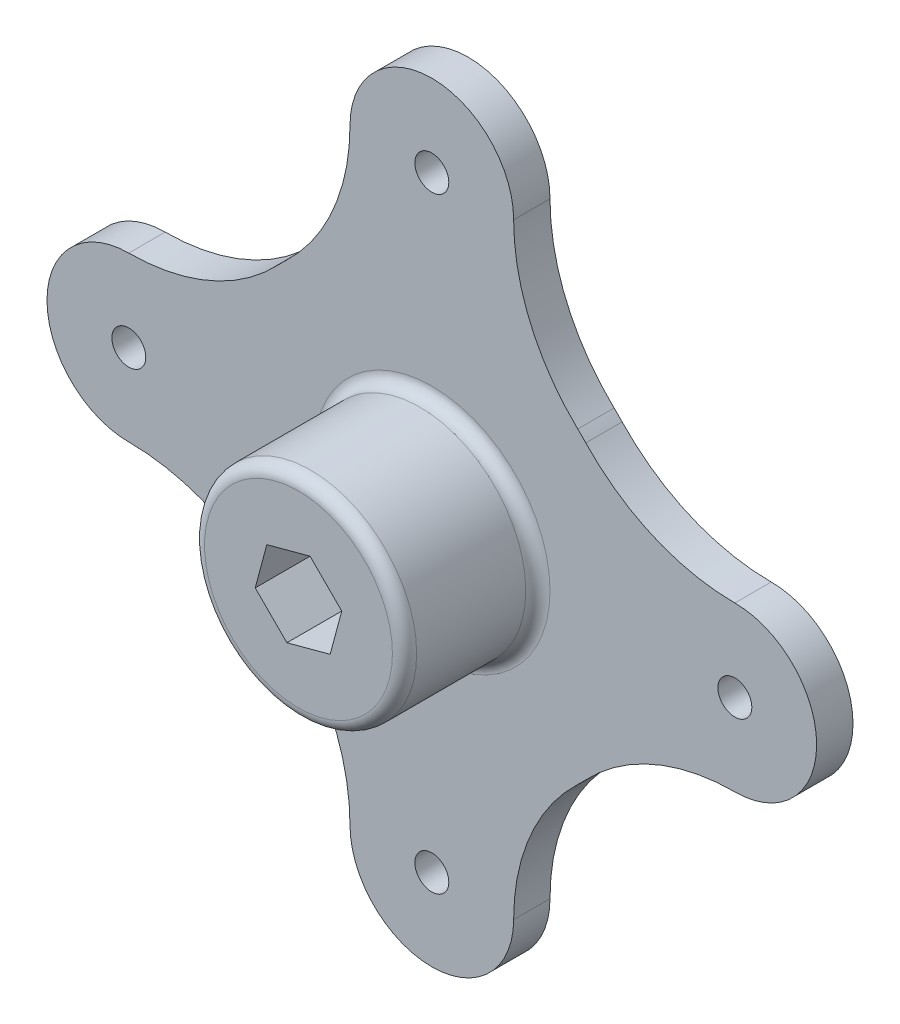
ISO-10303-21;
HEADER;
FILE_DESCRIPTION(('STEP AP214'),'2;1');
FILE_NAME('part.step','',(''),(''),'','','');
FILE_SCHEMA(('AUTOMOTIVE_DESIGN { 1 0 10303 214 1 1 1 1 }'));
ENDSEC;
DATA;
#1=APPLICATION_CONTEXT('core data for automotive mechanical design processes');
#2=APPLICATION_PROTOCOL_DEFINITION('international standard','automotive_design',2000,#1);
#3=PRODUCT_CONTEXT('',#1,'mechanical');
#4=PRODUCT('Part','Part','',(#3));
#5=PRODUCT_RELATED_PRODUCT_CATEGORY('part','',(#4));
#6=PRODUCT_DEFINITION_FORMATION('','',#4);
#7=PRODUCT_DEFINITION_CONTEXT('part definition',#1,'design');
#8=PRODUCT_DEFINITION('design','',#6,#7);
#9=PRODUCT_DEFINITION_SHAPE('','',#8);
#10=(LENGTH_UNIT() NAMED_UNIT(*) SI_UNIT(.MILLI.,.METRE.));
#11=(NAMED_UNIT(*) PLANE_ANGLE_UNIT() SI_UNIT($,.RADIAN.));
#12=(NAMED_UNIT(*) SI_UNIT($,.STERADIAN.) SOLID_ANGLE_UNIT());
#13=UNCERTAINTY_MEASURE_WITH_UNIT(LENGTH_MEASURE(1.E-05),#10,'distance_accuracy_value','');
#14=(GEOMETRIC_REPRESENTATION_CONTEXT(3) GLOBAL_UNCERTAINTY_ASSIGNED_CONTEXT((#13)) GLOBAL_UNIT_ASSIGNED_CONTEXT((#10,
#11,#12)) REPRESENTATION_CONTEXT('',''));
#15=CARTESIAN_POINT('',(0.,0.,0.));
#16=DIRECTION('',(0.,0.,1.));
#17=DIRECTION('',(1.,0.,0.));
#18=AXIS2_PLACEMENT_3D('',#15,#16,#17);
#19=CARTESIAN_POINT('',(0.,0.,14.));
#20=DIRECTION('',(0.,0.,1.));
#21=DIRECTION('',(1.,0.,0.));
#22=AXIS2_PLACEMENT_3D('',#19,#20,#21);
#23=PLANE('',#22);
#24=CARTESIAN_POINT('',(0.,0.,14.));
#25=DIRECTION('',(0.,0.,1.));
#26=DIRECTION('',(1.,0.,0.));
#27=AXIS2_PLACEMENT_3D('',#24,#25,#26);
#28=CIRCLE('',#27,7.75);
#29=CARTESIAN_POINT('',(7.75,0.,14.));
#30=VERTEX_POINT('',#29);
#31=EDGE_CURVE('E378',#30,#30,#28,.T.);
#32=ORIENTED_EDGE('',*,*,#31,.T.);
#33=EDGE_LOOP('',(#32));
#34=FACE_BOUND('',#33,.T.);
#35=DIRECTION('',(0.258819045102519,0.965925826289069,0.));
#36=VECTOR('',#35,1.);
#37=CARTESIAN_POINT('',(2.61278905896873,-2.61278905896872,14.));
#38=LINE('',#37,#36);
#39=CARTESIAN_POINT('',(2.61278905896873,-2.61278905896872,14.));
#40=VERTEX_POINT('',#39);
#41=CARTESIAN_POINT('',(3.56913622928131,0.956347170312597,14.));
#42=VERTEX_POINT('',#41);
#43=EDGE_CURVE('E207',#40,#42,#38,.T.);
#44=ORIENTED_EDGE('',*,*,#43,.F.);
#45=DIRECTION('',(0.965925826289068,0.258819045102523,0.));
#46=VECTOR('',#45,1.);
#47=CARTESIAN_POINT('',(-0.956347170312582,-3.56913622928132,14.));
#48=LINE('',#47,#46);
#49=CARTESIAN_POINT('',(-0.956347170312582,-3.56913622928132,14.));
#50=VERTEX_POINT('',#49);
#51=EDGE_CURVE('E190',#50,#40,#48,.T.);
#52=ORIENTED_EDGE('',*,*,#51,.F.);
#53=DIRECTION('',(0.707106781186549,-0.707106781186546,0.));
#54=VECTOR('',#53,1.);
#55=CARTESIAN_POINT('',(-3.56913622928131,-0.956347170312597,14.));
#56=LINE('',#55,#54);
#57=CARTESIAN_POINT('',(-3.56913622928131,-0.956347170312597,14.));
#58=VERTEX_POINT('',#57);
#59=EDGE_CURVE('E199',#58,#50,#56,.T.);
#60=ORIENTED_EDGE('',*,*,#59,.F.);
#61=DIRECTION('',(-0.258819045102519,-0.965925826289069,0.));
#62=VECTOR('',#61,1.);
#63=CARTESIAN_POINT('',(-2.61278905896873,2.61278905896872,14.));
#64=LINE('',#63,#62);
#65=CARTESIAN_POINT('',(-2.61278905896873,2.61278905896872,14.));
#66=VERTEX_POINT('',#65);
#67=EDGE_CURVE('E54',#66,#58,#64,.T.);
#68=ORIENTED_EDGE('',*,*,#67,.F.);
#69=DIRECTION('',(-0.965925826289068,-0.258819045102522,0.));
#70=VECTOR('',#69,1.);
#71=CARTESIAN_POINT('',(0.956347170312585,3.56913622928132,14.));
#72=LINE('',#71,#70);
#73=CARTESIAN_POINT('',(0.956347170312585,3.56913622928132,14.));
#74=VERTEX_POINT('',#73);
#75=EDGE_CURVE('E815',#74,#66,#72,.T.);
#76=ORIENTED_EDGE('',*,*,#75,.F.);
#77=DIRECTION('',(-0.707106781186549,0.707106781186546,0.));
#78=VECTOR('',#77,1.);
#79=CARTESIAN_POINT('',(3.56913622928131,0.956347170312597,14.));
#80=LINE('',#79,#78);
#81=EDGE_CURVE('E211',#42,#74,#80,.T.);
#82=ORIENTED_EDGE('',*,*,#81,.F.);
#83=EDGE_LOOP('',(#44,#52,#60,#68,#76,#82));
#84=FACE_BOUND('',#83,.T.);
#85=ADVANCED_FACE('F39',(#34,#84),#23,.T.);
#86=CARTESIAN_POINT('',(0.,0.,0.));
#87=DIRECTION('',(0.,0.,1.));
#88=DIRECTION('',(1.,0.,0.));
#89=AXIS2_PLACEMENT_3D('',#86,#87,#88);
#90=PLANE('',#89);
#91=CARTESIAN_POINT('',(0.,25.,0.));
#92=DIRECTION('',(0.,0.,1.));
#93=DIRECTION('',(1.,0.,0.));
#94=AXIS2_PLACEMENT_3D('',#91,#92,#93);
#95=CIRCLE('',#94,1.4);
#96=CARTESIAN_POINT('',(1.4,25.,0.));
#97=VERTEX_POINT('',#96);
#98=EDGE_CURVE('E239',#97,#97,#95,.T.);
#99=ORIENTED_EDGE('',*,*,#98,.T.);
#100=EDGE_LOOP('',(#99));
#101=FACE_BOUND('',#100,.T.);
#102=CARTESIAN_POINT('',(-25.,0.,0.));
#103=DIRECTION('',(0.,0.,1.));
#104=DIRECTION('',(1.,0.,0.));
#105=AXIS2_PLACEMENT_3D('',#102,#103,#104);
#106=CIRCLE('',#105,1.4);
#107=CARTESIAN_POINT('',(-23.6,0.,0.));
#108=VERTEX_POINT('',#107);
#109=EDGE_CURVE('E338',#108,#108,#106,.T.);
#110=ORIENTED_EDGE('',*,*,#109,.T.);
#111=EDGE_LOOP('',(#110));
#112=FACE_BOUND('',#111,.T.);
#113=CARTESIAN_POINT('',(1.7804351389411E-13,-25.,0.));
#114=DIRECTION('',(0.,0.,1.));
#115=DIRECTION('',(1.,0.,0.));
#116=AXIS2_PLACEMENT_3D('',#113,#114,#115);
#117=CIRCLE('',#116,1.4);
#118=CARTESIAN_POINT('',(1.40000000000018,-25.,0.));
#119=VERTEX_POINT('',#118);
#120=EDGE_CURVE('E335',#119,#119,#117,.T.);
#121=ORIENTED_EDGE('',*,*,#120,.T.);
#122=EDGE_LOOP('',(#121));
#123=FACE_BOUND('',#122,.T.);
#124=CARTESIAN_POINT('',(25.,2.61644259978738E-13,0.));
#125=DIRECTION('',(0.,0.,1.));
#126=DIRECTION('',(1.,0.,0.));
#127=AXIS2_PLACEMENT_3D('',#124,#125,#126);
#128=CIRCLE('',#127,1.4);
#129=CARTESIAN_POINT('',(26.4,2.61644259978738E-13,0.));
#130=VERTEX_POINT('',#129);
#131=EDGE_CURVE('E332',#130,#130,#128,.T.);
#132=ORIENTED_EDGE('',*,*,#131,.T.);
#133=EDGE_LOOP('',(#132));
#134=FACE_BOUND('',#133,.T.);
#135=CARTESIAN_POINT('',(0.,0.,0.));
#136=DIRECTION('',(0.,0.,1.));
#137=DIRECTION('',(1.,0.,0.));
#138=AXIS2_PLACEMENT_3D('',#135,#136,#137);
#139=CIRCLE('',#138,17.5);
#140=CARTESIAN_POINT('',(-12.0383576673137,-12.7014937969449,0.));
#141=VERTEX_POINT('',#140);
#142=CARTESIAN_POINT('',(-12.7014937969449,-12.0383576673137,0.));
#143=VERTEX_POINT('',#142);
#144=EDGE_CURVE('E202',#141,#143,#139,.F.);
#145=ORIENTED_EDGE('',*,*,#144,.T.);
#146=CARTESIAN_POINT('',(-25.,-23.6947674418604,0.));
#147=DIRECTION('',(0.,0.,1.));
#148=DIRECTION('',(1.,0.,0.));
#149=AXIS2_PLACEMENT_3D('',#146,#147,#148);
#150=CIRCLE('',#149,16.9447674418604);
#151=CARTESIAN_POINT('',(-25.,-6.75000000000009,0.));
#152=VERTEX_POINT('',#151);
#153=EDGE_CURVE('E329',#152,#143,#150,.F.);
#154=ORIENTED_EDGE('',*,*,#153,.F.);
#155=CARTESIAN_POINT('',(-25.,0.,0.));
#156=DIRECTION('',(0.,0.,1.));
#157=DIRECTION('',(1.,0.,0.));
#158=AXIS2_PLACEMENT_3D('',#155,#156,#157);
#159=CIRCLE('',#158,6.75);
#160=CARTESIAN_POINT('',(-25.,6.75,0.));
#161=VERTEX_POINT('',#160);
#162=EDGE_CURVE('E327',#161,#152,#159,.T.);
#163=ORIENTED_EDGE('',*,*,#162,.F.);
#164=CARTESIAN_POINT('',(-25.,23.6947674418604,0.));
#165=DIRECTION('',(0.,0.,1.));
#166=DIRECTION('',(1.,0.,0.));
#167=AXIS2_PLACEMENT_3D('',#164,#165,#166);
#168=CIRCLE('',#167,16.9447674418604);
#169=CARTESIAN_POINT('',(-12.7014937969449,12.0383576673137,0.));
#170=VERTEX_POINT('',#169);
#171=EDGE_CURVE('E324',#161,#170,#168,.T.);
#172=ORIENTED_EDGE('',*,*,#171,.T.);
#173=CARTESIAN_POINT('',(0.,0.,0.));
#174=DIRECTION('',(0.,0.,1.));
#175=DIRECTION('',(1.,0.,0.));
#176=AXIS2_PLACEMENT_3D('',#173,#174,#175);
#177=CIRCLE('',#176,17.5);
#178=CARTESIAN_POINT('',(-12.0383576673137,12.7014937969449,0.));
#179=VERTEX_POINT('',#178);
#180=EDGE_CURVE('E321',#170,#179,#177,.F.);
#181=ORIENTED_EDGE('',*,*,#180,.T.);
#182=CARTESIAN_POINT('',(-23.6947674418604,25.,0.));
#183=DIRECTION('',(0.,0.,1.));
#184=DIRECTION('',(1.,0.,0.));
#185=AXIS2_PLACEMENT_3D('',#182,#183,#184);
#186=CIRCLE('',#185,16.9447674418604);
#187=CARTESIAN_POINT('',(-6.75,25.,0.));
#188=VERTEX_POINT('',#187);
#189=EDGE_CURVE('E318',#188,#179,#186,.F.);
#190=ORIENTED_EDGE('',*,*,#189,.F.);
#191=CARTESIAN_POINT('',(0.,25.,0.));
#192=DIRECTION('',(0.,0.,1.));
#193=DIRECTION('',(1.,0.,0.));
#194=AXIS2_PLACEMENT_3D('',#191,#192,#193);
#195=CIRCLE('',#194,6.75);
#196=CARTESIAN_POINT('',(6.75,25.,0.));
#197=VERTEX_POINT('',#196);
#198=EDGE_CURVE('E316',#197,#188,#195,.T.);
#199=ORIENTED_EDGE('',*,*,#198,.F.);
#200=CARTESIAN_POINT('',(23.6947674418604,25.,0.));
#201=DIRECTION('',(0.,0.,1.));
#202=DIRECTION('',(1.,0.,0.));
#203=AXIS2_PLACEMENT_3D('',#200,#201,#202);
#204=CIRCLE('',#203,16.9447674418604);
#205=CARTESIAN_POINT('',(12.0383576673137,12.7014937969449,0.));
#206=VERTEX_POINT('',#205);
#207=EDGE_CURVE('E313',#197,#206,#204,.T.);
#208=ORIENTED_EDGE('',*,*,#207,.T.);
#209=CARTESIAN_POINT('',(0.,0.,0.));
#210=DIRECTION('',(0.,0.,1.));
#211=DIRECTION('',(1.,0.,0.));
#212=AXIS2_PLACEMENT_3D('',#209,#210,#211);
#213=CIRCLE('',#212,17.5);
#214=CARTESIAN_POINT('',(12.7014937969449,12.0383576673137,0.));
#215=VERTEX_POINT('',#214);
#216=EDGE_CURVE('E310',#206,#215,#213,.F.);
#217=ORIENTED_EDGE('',*,*,#216,.T.);
#218=CARTESIAN_POINT('',(25.,23.6947674418604,0.));
#219=DIRECTION('',(0.,0.,1.));
#220=DIRECTION('',(1.,0.,0.));
#221=AXIS2_PLACEMENT_3D('',#218,#219,#220);
#222=CIRCLE('',#221,16.9447674418604);
#223=CARTESIAN_POINT('',(25.,6.75000000000026,0.));
#224=VERTEX_POINT('',#223);
#225=EDGE_CURVE('E307',#224,#215,#222,.F.);
#226=ORIENTED_EDGE('',*,*,#225,.F.);
#227=CARTESIAN_POINT('',(25.,2.61644259978738E-13,0.));
#228=DIRECTION('',(0.,0.,1.));
#229=DIRECTION('',(1.,0.,0.));
#230=AXIS2_PLACEMENT_3D('',#227,#228,#229);
#231=CIRCLE('',#230,6.75);
#232=CARTESIAN_POINT('',(25.,-6.75,0.));
#233=VERTEX_POINT('',#232);
#234=EDGE_CURVE('E305',#233,#224,#231,.T.);
#235=ORIENTED_EDGE('',*,*,#234,.F.);
#236=CARTESIAN_POINT('',(25.,-23.6947674418604,0.));
#237=DIRECTION('',(0.,0.,1.));
#238=DIRECTION('',(1.,0.,0.));
#239=AXIS2_PLACEMENT_3D('',#236,#237,#238);
#240=CIRCLE('',#239,16.9447674418604);
#241=CARTESIAN_POINT('',(12.7014937969449,-12.0383576673137,0.));
#242=VERTEX_POINT('',#241);
#243=EDGE_CURVE('E302',#233,#242,#240,.T.);
#244=ORIENTED_EDGE('',*,*,#243,.T.);
#245=CARTESIAN_POINT('',(0.,0.,0.));
#246=DIRECTION('',(0.,0.,1.));
#247=DIRECTION('',(1.,0.,0.));
#248=AXIS2_PLACEMENT_3D('',#245,#246,#247);
#249=CIRCLE('',#248,17.5);
#250=CARTESIAN_POINT('',(12.0383576673137,-12.7014937969449,0.));
#251=VERTEX_POINT('',#250);
#252=EDGE_CURVE('E299',#242,#251,#249,.F.);
#253=ORIENTED_EDGE('',*,*,#252,.T.);
#254=CARTESIAN_POINT('',(23.6947674418604,-25.,0.));
#255=DIRECTION('',(0.,0.,1.));
#256=DIRECTION('',(1.,0.,0.));
#257=AXIS2_PLACEMENT_3D('',#254,#255,#256);
#258=CIRCLE('',#257,16.9447674418604);
#259=CARTESIAN_POINT('',(6.75000000000018,-25.,0.));
#260=VERTEX_POINT('',#259);
#261=EDGE_CURVE('E296',#260,#251,#258,.F.);
#262=ORIENTED_EDGE('',*,*,#261,.F.);
#263=CARTESIAN_POINT('',(1.7804351389411E-13,-25.,0.));
#264=DIRECTION('',(0.,0.,1.));
#265=DIRECTION('',(1.,0.,0.));
#266=AXIS2_PLACEMENT_3D('',#263,#264,#265);
#267=CIRCLE('',#266,6.75);
#268=CARTESIAN_POINT('',(-6.75,-25.,0.));
#269=VERTEX_POINT('',#268);
#270=EDGE_CURVE('E294',#269,#260,#267,.T.);
#271=ORIENTED_EDGE('',*,*,#270,.F.);
#272=CARTESIAN_POINT('',(-23.6947674418605,-25.,0.));
#273=DIRECTION('',(0.,0.,1.));
#274=DIRECTION('',(1.,0.,0.));
#275=AXIS2_PLACEMENT_3D('',#272,#273,#274);
#276=CIRCLE('',#275,16.9447674418604);
#277=EDGE_CURVE('E291',#269,#141,#276,.T.);
#278=ORIENTED_EDGE('',*,*,#277,.T.);
#279=EDGE_LOOP('',(#145,#154,#163,#172,#181,#190,#199,#208,#217,#226,#235,#244,#253,#262,#271,#278));
#280=FACE_BOUND('',#279,.T.);
#281=DIRECTION('',(0.965925826289068,0.258819045102523,0.));
#282=VECTOR('',#281,1.);
#283=CARTESIAN_POINT('',(-0.956347170312582,-3.56913622928132,0.));
#284=LINE('',#283,#282);
#285=CARTESIAN_POINT('',(-0.956347170312582,-3.56913622928132,0.));
#286=VERTEX_POINT('',#285);
#287=CARTESIAN_POINT('',(2.61278905896873,-2.61278905896872,0.));
#288=VERTEX_POINT('',#287);
#289=EDGE_CURVE('E62',#286,#288,#284,.T.);
#290=ORIENTED_EDGE('',*,*,#289,.T.);
#291=DIRECTION('',(0.258819045102519,0.965925826289069,0.));
#292=VECTOR('',#291,1.);
#293=CARTESIAN_POINT('',(2.61278905896873,-2.61278905896872,0.));
#294=LINE('',#293,#292);
#295=CARTESIAN_POINT('',(3.56913622928131,0.956347170312597,0.));
#296=VERTEX_POINT('',#295);
#297=EDGE_CURVE('E209',#288,#296,#294,.T.);
#298=ORIENTED_EDGE('',*,*,#297,.T.);
#299=DIRECTION('',(-0.707106781186549,0.707106781186546,0.));
#300=VECTOR('',#299,1.);
#301=CARTESIAN_POINT('',(3.56913622928131,0.956347170312597,0.));
#302=LINE('',#301,#300);
#303=CARTESIAN_POINT('',(0.956347170312585,3.56913622928132,0.));
#304=VERTEX_POINT('',#303);
#305=EDGE_CURVE('E217',#296,#304,#302,.T.);
#306=ORIENTED_EDGE('',*,*,#305,.T.);
#307=DIRECTION('',(-0.965925826289068,-0.258819045102522,0.));
#308=VECTOR('',#307,1.);
#309=CARTESIAN_POINT('',(0.956347170312585,3.56913622928132,0.));
#310=LINE('',#309,#308);
#311=CARTESIAN_POINT('',(-2.61278905896873,2.61278905896872,0.));
#312=VERTEX_POINT('',#311);
#313=EDGE_CURVE('E220',#304,#312,#310,.T.);
#314=ORIENTED_EDGE('',*,*,#313,.T.);
#315=DIRECTION('',(-0.258819045102519,-0.965925826289069,0.));
#316=VECTOR('',#315,1.);
#317=CARTESIAN_POINT('',(-2.61278905896873,2.61278905896872,0.));
#318=LINE('',#317,#316);
#319=CARTESIAN_POINT('',(-3.56913622928131,-0.956347170312597,0.));
#320=VERTEX_POINT('',#319);
#321=EDGE_CURVE('E223',#312,#320,#318,.T.);
#322=ORIENTED_EDGE('',*,*,#321,.T.);
#323=DIRECTION('',(0.707106781186549,-0.707106781186546,0.));
#324=VECTOR('',#323,1.);
#325=CARTESIAN_POINT('',(-3.56913622928131,-0.956347170312597,0.));
#326=LINE('',#325,#324);
#327=EDGE_CURVE('E196',#320,#286,#326,.T.);
#328=ORIENTED_EDGE('',*,*,#327,.T.);
#329=EDGE_LOOP('',(#290,#298,#306,#314,#322,#328));
#330=FACE_BOUND('',#329,.T.);
#331=ADVANCED_FACE('F396',(#101,#112,#123,#134,#280,#330),#90,.F.);
#332=CARTESIAN_POINT('',(0.,0.,14.));
#333=DIRECTION('',(0.,0.,-1.));
#334=DIRECTION('',(-1.,0.,0.));
#335=AXIS2_PLACEMENT_3D('',#332,#333,#334);
#336=CYLINDRICAL_SURFACE('',#335,8.75);
#337=CARTESIAN_POINT('',(0.,0.,13.));
#338=DIRECTION('',(0.,0.,1.));
#339=DIRECTION('',(1.,0.,0.));
#340=AXIS2_PLACEMENT_3D('',#337,#338,#339);
#341=CIRCLE('',#340,8.75);
#342=CARTESIAN_POINT('',(8.75,0.,13.));
#343=VERTEX_POINT('',#342);
#344=EDGE_CURVE('E47',#343,#343,#341,.F.);
#345=ORIENTED_EDGE('',*,*,#344,.T.);
#346=EDGE_LOOP('',(#345));
#347=FACE_BOUND('',#346,.T.);
#348=CARTESIAN_POINT('',(0.,0.,4.));
#349=DIRECTION('',(0.,0.,1.));
#350=DIRECTION('',(1.,0.,0.));
#351=AXIS2_PLACEMENT_3D('',#348,#349,#350);
#352=CIRCLE('',#351,8.75);
#353=CARTESIAN_POINT('',(8.75,0.,4.));
#354=VERTEX_POINT('',#353);
#355=EDGE_CURVE('E381',#354,#354,#352,.T.);
#356=ORIENTED_EDGE('',*,*,#355,.T.);
#357=EDGE_LOOP('',(#356));
#358=FACE_BOUND('',#357,.T.);
#359=ADVANCED_FACE('F386',(#347,#358),#336,.T.);
#360=CARTESIAN_POINT('',(0.,0.,3.));
#361=DIRECTION('',(0.,0.,-1.));
#362=DIRECTION('',(-1.,0.,0.));
#363=AXIS2_PLACEMENT_3D('',#360,#361,#362);
#364=CYLINDRICAL_SURFACE('',#363,17.5);
#365=ORIENTED_EDGE('',*,*,#144,.F.);
#366=DIRECTION('',(0.,0.,-1.));
#367=VECTOR('',#366,1.);
#368=CARTESIAN_POINT('',(-12.0383576673137,-12.7014937969449,3.));
#369=LINE('',#368,#367);
#370=CARTESIAN_POINT('',(-12.0383576673137,-12.7014937969449,3.));
#371=VERTEX_POINT('',#370);
#372=EDGE_CURVE('E376',#371,#141,#369,.T.);
#373=ORIENTED_EDGE('',*,*,#372,.F.);
#374=CARTESIAN_POINT('',(0.,0.,3.));
#375=DIRECTION('',(0.,0.,1.));
#376=DIRECTION('',(1.,0.,0.));
#377=AXIS2_PLACEMENT_3D('',#374,#375,#376);
#378=CIRCLE('',#377,17.5);
#379=CARTESIAN_POINT('',(-12.7014937969449,-12.0383576673137,3.));
#380=VERTEX_POINT('',#379);
#381=EDGE_CURVE('E235',#371,#380,#378,.F.);
#382=ORIENTED_EDGE('',*,*,#381,.T.);
#383=DIRECTION('',(0.,0.,-1.));
#384=VECTOR('',#383,1.);
#385=CARTESIAN_POINT('',(-12.7014937969449,-12.0383576673137,3.));
#386=LINE('',#385,#384);
#387=EDGE_CURVE('E288',#380,#143,#386,.T.);
#388=ORIENTED_EDGE('',*,*,#387,.T.);
#389=EDGE_LOOP('',(#365,#373,#382,#388));
#390=FACE_BOUND('',#389,.T.);
#391=ADVANCED_FACE('F404',(#390),#364,.T.);
#392=CARTESIAN_POINT('',(-23.6947674418605,-25.,3.));
#393=DIRECTION('',(0.,0.,-1.));
#394=DIRECTION('',(-1.,0.,0.));
#395=AXIS2_PLACEMENT_3D('',#392,#393,#394);
#396=CYLINDRICAL_SURFACE('',#395,16.9447674418604);
#397=ORIENTED_EDGE('',*,*,#277,.F.);
#398=DIRECTION('',(0.,0.,-1.));
#399=VECTOR('',#398,1.);
#400=CARTESIAN_POINT('',(-6.75,-25.,3.));
#401=LINE('',#400,#399);
#402=CARTESIAN_POINT('',(-6.75,-25.,3.));
#403=VERTEX_POINT('',#402);
#404=EDGE_CURVE('E374',#403,#269,#401,.T.);
#405=ORIENTED_EDGE('',*,*,#404,.F.);
#406=CARTESIAN_POINT('',(-23.6947674418605,-25.,3.));
#407=DIRECTION('',(0.,0.,1.));
#408=DIRECTION('',(1.,0.,0.));
#409=AXIS2_PLACEMENT_3D('',#406,#407,#408);
#410=CIRCLE('',#409,16.9447674418604);
#411=EDGE_CURVE('E238',#403,#371,#410,.T.);
#412=ORIENTED_EDGE('',*,*,#411,.T.);
#413=ORIENTED_EDGE('',*,*,#372,.T.);
#414=EDGE_LOOP('',(#397,#405,#412,#413));
#415=FACE_BOUND('',#414,.T.);
#416=ADVANCED_FACE('F411',(#415),#396,.F.);
#417=CARTESIAN_POINT('',(1.7804351389411E-13,-25.,3.));
#418=DIRECTION('',(0.,0.,-1.));
#419=DIRECTION('',(-1.,0.,0.));
#420=AXIS2_PLACEMENT_3D('',#417,#418,#419);
#421=CYLINDRICAL_SURFACE('',#420,6.75);
#422=ORIENTED_EDGE('',*,*,#270,.T.);
#423=DIRECTION('',(0.,0.,-1.));
#424=VECTOR('',#423,1.);
#425=CARTESIAN_POINT('',(6.75000000000018,-25.,3.));
#426=LINE('',#425,#424);
#427=CARTESIAN_POINT('',(6.75000000000018,-25.,3.));
#428=VERTEX_POINT('',#427);
#429=EDGE_CURVE('E371',#428,#260,#426,.T.);
#430=ORIENTED_EDGE('',*,*,#429,.F.);
#431=CARTESIAN_POINT('',(1.7804351389411E-13,-25.,3.));
#432=DIRECTION('',(0.,0.,1.));
#433=DIRECTION('',(1.,0.,0.));
#434=AXIS2_PLACEMENT_3D('',#431,#432,#433);
#435=CIRCLE('',#434,6.75);
#436=EDGE_CURVE('E242',#403,#428,#435,.T.);
#437=ORIENTED_EDGE('',*,*,#436,.F.);
#438=ORIENTED_EDGE('',*,*,#404,.T.);
#439=EDGE_LOOP('',(#422,#430,#437,#438));
#440=FACE_BOUND('',#439,.T.);
#441=ADVANCED_FACE('F416',(#440),#421,.T.);
#442=CARTESIAN_POINT('',(23.6947674418604,-25.,3.));
#443=DIRECTION('',(0.,0.,-1.));
#444=DIRECTION('',(-1.,0.,0.));
#445=AXIS2_PLACEMENT_3D('',#442,#443,#444);
#446=CYLINDRICAL_SURFACE('',#445,16.9447674418604);
#447=ORIENTED_EDGE('',*,*,#261,.T.);
#448=DIRECTION('',(0.,0.,-1.));
#449=VECTOR('',#448,1.);
#450=CARTESIAN_POINT('',(12.0383576673137,-12.7014937969449,3.));
#451=LINE('',#450,#449);
#452=CARTESIAN_POINT('',(12.0383576673137,-12.7014937969449,3.));
#453=VERTEX_POINT('',#452);
#454=EDGE_CURVE('E369',#453,#251,#451,.T.);
#455=ORIENTED_EDGE('',*,*,#454,.F.);
#456=CARTESIAN_POINT('',(23.6947674418604,-25.,3.));
#457=DIRECTION('',(0.,0.,1.));
#458=DIRECTION('',(1.,0.,0.));
#459=AXIS2_PLACEMENT_3D('',#456,#457,#458);
#460=CIRCLE('',#459,16.9447674418604);
#461=EDGE_CURVE('E244',#428,#453,#460,.F.);
#462=ORIENTED_EDGE('',*,*,#461,.F.);
#463=ORIENTED_EDGE('',*,*,#429,.T.);
#464=EDGE_LOOP('',(#447,#455,#462,#463));
#465=FACE_BOUND('',#464,.T.);
#466=ADVANCED_FACE('F485',(#465),#446,.F.);
#467=CARTESIAN_POINT('',(0.,0.,3.));
#468=DIRECTION('',(0.,0.,-1.));
#469=DIRECTION('',(-1.,0.,0.));
#470=AXIS2_PLACEMENT_3D('',#467,#468,#469);
#471=CYLINDRICAL_SURFACE('',#470,17.5);
#472=ORIENTED_EDGE('',*,*,#252,.F.);
#473=DIRECTION('',(0.,0.,-1.));
#474=VECTOR('',#473,1.);
#475=CARTESIAN_POINT('',(12.7014937969449,-12.0383576673137,3.));
#476=LINE('',#475,#474);
#477=CARTESIAN_POINT('',(12.7014937969449,-12.0383576673137,3.));
#478=VERTEX_POINT('',#477);
#479=EDGE_CURVE('E367',#478,#242,#476,.T.);
#480=ORIENTED_EDGE('',*,*,#479,.F.);
#481=CARTESIAN_POINT('',(0.,0.,3.));
#482=DIRECTION('',(0.,0.,1.));
#483=DIRECTION('',(1.,0.,0.));
#484=AXIS2_PLACEMENT_3D('',#481,#482,#483);
#485=CIRCLE('',#484,17.5);
#486=EDGE_CURVE('E246',#478,#453,#485,.F.);
#487=ORIENTED_EDGE('',*,*,#486,.T.);
#488=ORIENTED_EDGE('',*,*,#454,.T.);
#489=EDGE_LOOP('',(#472,#480,#487,#488));
#490=FACE_BOUND('',#489,.T.);
#491=ADVANCED_FACE('F482',(#490),#471,.T.);
#492=CARTESIAN_POINT('',(25.,-23.6947674418604,3.));
#493=DIRECTION('',(0.,0.,-1.));
#494=DIRECTION('',(-1.,0.,0.));
#495=AXIS2_PLACEMENT_3D('',#492,#493,#494);
#496=CYLINDRICAL_SURFACE('',#495,16.9447674418604);
#497=ORIENTED_EDGE('',*,*,#243,.F.);
#498=DIRECTION('',(0.,0.,-1.));
#499=VECTOR('',#498,1.);
#500=CARTESIAN_POINT('',(25.,-6.75,3.));
#501=LINE('',#500,#499);
#502=CARTESIAN_POINT('',(25.,-6.75,3.));
#503=VERTEX_POINT('',#502);
#504=EDGE_CURVE('E365',#503,#233,#501,.T.);
#505=ORIENTED_EDGE('',*,*,#504,.F.);
#506=CARTESIAN_POINT('',(25.,-23.6947674418604,3.));
#507=DIRECTION('',(0.,0.,1.));
#508=DIRECTION('',(1.,0.,0.));
#509=AXIS2_PLACEMENT_3D('',#506,#507,#508);
#510=CIRCLE('',#509,16.9447674418604);
#511=EDGE_CURVE('E249',#503,#478,#510,.T.);
#512=ORIENTED_EDGE('',*,*,#511,.T.);
#513=ORIENTED_EDGE('',*,*,#479,.T.);
#514=EDGE_LOOP('',(#497,#505,#512,#513));
#515=FACE_BOUND('',#514,.T.);
#516=ADVANCED_FACE('F478',(#515),#496,.F.);
#517=CARTESIAN_POINT('',(25.,2.61644259978738E-13,3.));
#518=DIRECTION('',(0.,0.,-1.));
#519=DIRECTION('',(-1.,0.,0.));
#520=AXIS2_PLACEMENT_3D('',#517,#518,#519);
#521=CYLINDRICAL_SURFACE('',#520,6.75);
#522=ORIENTED_EDGE('',*,*,#234,.T.);
#523=DIRECTION('',(0.,0.,-1.));
#524=VECTOR('',#523,1.);
#525=CARTESIAN_POINT('',(25.,6.75000000000026,3.));
#526=LINE('',#525,#524);
#527=CARTESIAN_POINT('',(25.,6.75000000000026,3.));
#528=VERTEX_POINT('',#527);
#529=EDGE_CURVE('E362',#528,#224,#526,.T.);
#530=ORIENTED_EDGE('',*,*,#529,.F.);
#531=CARTESIAN_POINT('',(25.,2.61644259978738E-13,3.));
#532=DIRECTION('',(0.,0.,1.));
#533=DIRECTION('',(1.,0.,0.));
#534=AXIS2_PLACEMENT_3D('',#531,#532,#533);
#535=CIRCLE('',#534,6.75);
#536=EDGE_CURVE('E252',#503,#528,#535,.T.);
#537=ORIENTED_EDGE('',*,*,#536,.F.);
#538=ORIENTED_EDGE('',*,*,#504,.T.);
#539=EDGE_LOOP('',(#522,#530,#537,#538));
#540=FACE_BOUND('',#539,.T.);
#541=ADVANCED_FACE('F474',(#540),#521,.T.);
#542=CARTESIAN_POINT('',(25.,23.6947674418604,3.));
#543=DIRECTION('',(0.,0.,-1.));
#544=DIRECTION('',(-1.,0.,0.));
#545=AXIS2_PLACEMENT_3D('',#542,#543,#544);
#546=CYLINDRICAL_SURFACE('',#545,16.9447674418604);
#547=ORIENTED_EDGE('',*,*,#225,.T.);
#548=DIRECTION('',(0.,0.,-1.));
#549=VECTOR('',#548,1.);
#550=CARTESIAN_POINT('',(12.7014937969449,12.0383576673137,3.));
#551=LINE('',#550,#549);
#552=CARTESIAN_POINT('',(12.7014937969449,12.0383576673137,3.));
#553=VERTEX_POINT('',#552);
#554=EDGE_CURVE('E360',#553,#215,#551,.T.);
#555=ORIENTED_EDGE('',*,*,#554,.F.);
#556=CARTESIAN_POINT('',(25.,23.6947674418604,3.));
#557=DIRECTION('',(0.,0.,1.));
#558=DIRECTION('',(1.,0.,0.));
#559=AXIS2_PLACEMENT_3D('',#556,#557,#558);
#560=CIRCLE('',#559,16.9447674418604);
#561=EDGE_CURVE('E254',#528,#553,#560,.F.);
#562=ORIENTED_EDGE('',*,*,#561,.F.);
#563=ORIENTED_EDGE('',*,*,#529,.T.);
#564=EDGE_LOOP('',(#547,#555,#562,#563));
#565=FACE_BOUND('',#564,.T.);
#566=ADVANCED_FACE('F470',(#565),#546,.F.);
#567=CARTESIAN_POINT('',(0.,0.,3.));
#568=DIRECTION('',(0.,0.,-1.));
#569=DIRECTION('',(-1.,0.,0.));
#570=AXIS2_PLACEMENT_3D('',#567,#568,#569);
#571=CYLINDRICAL_SURFACE('',#570,17.5);
#572=ORIENTED_EDGE('',*,*,#216,.F.);
#573=DIRECTION('',(0.,0.,-1.));
#574=VECTOR('',#573,1.);
#575=CARTESIAN_POINT('',(12.0383576673137,12.7014937969449,3.));
#576=LINE('',#575,#574);
#577=CARTESIAN_POINT('',(12.0383576673137,12.7014937969449,3.));
#578=VERTEX_POINT('',#577);
#579=EDGE_CURVE('E358',#578,#206,#576,.T.);
#580=ORIENTED_EDGE('',*,*,#579,.F.);
#581=CARTESIAN_POINT('',(0.,0.,3.));
#582=DIRECTION('',(0.,0.,1.));
#583=DIRECTION('',(1.,0.,0.));
#584=AXIS2_PLACEMENT_3D('',#581,#582,#583);
#585=CIRCLE('',#584,17.5);
#586=EDGE_CURVE('E256',#578,#553,#585,.F.);
#587=ORIENTED_EDGE('',*,*,#586,.T.);
#588=ORIENTED_EDGE('',*,*,#554,.T.);
#589=EDGE_LOOP('',(#572,#580,#587,#588));
#590=FACE_BOUND('',#589,.T.);
#591=ADVANCED_FACE('F465',(#590),#571,.T.);
#592=CARTESIAN_POINT('',(23.6947674418604,25.,3.));
#593=DIRECTION('',(0.,0.,-1.));
#594=DIRECTION('',(-1.,0.,0.));
#595=AXIS2_PLACEMENT_3D('',#592,#593,#594);
#596=CYLINDRICAL_SURFACE('',#595,16.9447674418604);
#597=ORIENTED_EDGE('',*,*,#207,.F.);
#598=DIRECTION('',(0.,0.,-1.));
#599=VECTOR('',#598,1.);
#600=CARTESIAN_POINT('',(6.75,25.,3.));
#601=LINE('',#600,#599);
#602=CARTESIAN_POINT('',(6.75,25.,3.));
#603=VERTEX_POINT('',#602);
#604=EDGE_CURVE('E356',#603,#197,#601,.T.);
#605=ORIENTED_EDGE('',*,*,#604,.F.);
#606=CARTESIAN_POINT('',(23.6947674418604,25.,3.));
#607=DIRECTION('',(0.,0.,1.));
#608=DIRECTION('',(1.,0.,0.));
#609=AXIS2_PLACEMENT_3D('',#606,#607,#608);
#610=CIRCLE('',#609,16.9447674418604);
#611=EDGE_CURVE('E259',#603,#578,#610,.T.);
#612=ORIENTED_EDGE('',*,*,#611,.T.);
#613=ORIENTED_EDGE('',*,*,#579,.T.);
#614=EDGE_LOOP('',(#597,#605,#612,#613));
#615=FACE_BOUND('',#614,.T.);
#616=ADVANCED_FACE('F460',(#615),#596,.F.);
#617=CARTESIAN_POINT('',(0.,25.,3.));
#618=DIRECTION('',(0.,0.,-1.));
#619=DIRECTION('',(-1.,0.,0.));
#620=AXIS2_PLACEMENT_3D('',#617,#618,#619);
#621=CYLINDRICAL_SURFACE('',#620,6.75);
#622=ORIENTED_EDGE('',*,*,#198,.T.);
#623=DIRECTION('',(0.,0.,-1.));
#624=VECTOR('',#623,1.);
#625=CARTESIAN_POINT('',(-6.75,25.,3.));
#626=LINE('',#625,#624);
#627=CARTESIAN_POINT('',(-6.75,25.,3.));
#628=VERTEX_POINT('',#627);
#629=EDGE_CURVE('E353',#628,#188,#626,.T.);
#630=ORIENTED_EDGE('',*,*,#629,.F.);
#631=CARTESIAN_POINT('',(0.,25.,3.));
#632=DIRECTION('',(0.,0.,1.));
#633=DIRECTION('',(1.,0.,0.));
#634=AXIS2_PLACEMENT_3D('',#631,#632,#633);
#635=CIRCLE('',#634,6.75);
#636=EDGE_CURVE('E262',#603,#628,#635,.T.);
#637=ORIENTED_EDGE('',*,*,#636,.F.);
#638=ORIENTED_EDGE('',*,*,#604,.T.);
#639=EDGE_LOOP('',(#622,#630,#637,#638));
#640=FACE_BOUND('',#639,.T.);
#641=ADVANCED_FACE('F457',(#640),#621,.T.);
#642=CARTESIAN_POINT('',(-23.6947674418604,25.,3.));
#643=DIRECTION('',(0.,0.,-1.));
#644=DIRECTION('',(-1.,0.,0.));
#645=AXIS2_PLACEMENT_3D('',#642,#643,#644);
#646=CYLINDRICAL_SURFACE('',#645,16.9447674418604);
#647=ORIENTED_EDGE('',*,*,#189,.T.);
#648=DIRECTION('',(0.,0.,-1.));
#649=VECTOR('',#648,1.);
#650=CARTESIAN_POINT('',(-12.0383576673137,12.7014937969449,3.));
#651=LINE('',#650,#649);
#652=CARTESIAN_POINT('',(-12.0383576673137,12.7014937969449,3.));
#653=VERTEX_POINT('',#652);
#654=EDGE_CURVE('E351',#653,#179,#651,.T.);
#655=ORIENTED_EDGE('',*,*,#654,.F.);
#656=CARTESIAN_POINT('',(-23.6947674418604,25.,3.));
#657=DIRECTION('',(0.,0.,1.));
#658=DIRECTION('',(1.,0.,0.));
#659=AXIS2_PLACEMENT_3D('',#656,#657,#658);
#660=CIRCLE('',#659,16.9447674418604);
#661=EDGE_CURVE('E264',#628,#653,#660,.F.);
#662=ORIENTED_EDGE('',*,*,#661,.F.);
#663=ORIENTED_EDGE('',*,*,#629,.T.);
#664=EDGE_LOOP('',(#647,#655,#662,#663));
#665=FACE_BOUND('',#664,.T.);
#666=ADVANCED_FACE('F452',(#665),#646,.F.);
#667=CARTESIAN_POINT('',(0.,0.,3.));
#668=DIRECTION('',(0.,0.,-1.));
#669=DIRECTION('',(-1.,0.,0.));
#670=AXIS2_PLACEMENT_3D('',#667,#668,#669);
#671=CYLINDRICAL_SURFACE('',#670,17.5);
#672=ORIENTED_EDGE('',*,*,#180,.F.);
#673=DIRECTION('',(0.,0.,-1.));
#674=VECTOR('',#673,1.);
#675=CARTESIAN_POINT('',(-12.7014937969449,12.0383576673137,3.));
#676=LINE('',#675,#674);
#677=CARTESIAN_POINT('',(-12.7014937969449,12.0383576673137,3.));
#678=VERTEX_POINT('',#677);
#679=EDGE_CURVE('E349',#678,#170,#676,.T.);
#680=ORIENTED_EDGE('',*,*,#679,.F.);
#681=CARTESIAN_POINT('',(0.,0.,3.));
#682=DIRECTION('',(0.,0.,1.));
#683=DIRECTION('',(1.,0.,0.));
#684=AXIS2_PLACEMENT_3D('',#681,#682,#683);
#685=CIRCLE('',#684,17.5);
#686=EDGE_CURVE('E266',#678,#653,#685,.F.);
#687=ORIENTED_EDGE('',*,*,#686,.T.);
#688=ORIENTED_EDGE('',*,*,#654,.T.);
#689=EDGE_LOOP('',(#672,#680,#687,#688));
#690=FACE_BOUND('',#689,.T.);
#691=ADVANCED_FACE('F446',(#690),#671,.T.);
#692=CARTESIAN_POINT('',(-25.,23.6947674418604,3.));
#693=DIRECTION('',(0.,0.,-1.));
#694=DIRECTION('',(-1.,0.,0.));
#695=AXIS2_PLACEMENT_3D('',#692,#693,#694);
#696=CYLINDRICAL_SURFACE('',#695,16.9447674418604);
#697=ORIENTED_EDGE('',*,*,#171,.F.);
#698=DIRECTION('',(0.,0.,-1.));
#699=VECTOR('',#698,1.);
#700=CARTESIAN_POINT('',(-25.,6.75,3.));
#701=LINE('',#700,#699);
#702=CARTESIAN_POINT('',(-25.,6.75,3.));
#703=VERTEX_POINT('',#702);
#704=EDGE_CURVE('E347',#703,#161,#701,.T.);
#705=ORIENTED_EDGE('',*,*,#704,.F.);
#706=CARTESIAN_POINT('',(-25.,23.6947674418604,3.));
#707=DIRECTION('',(0.,0.,1.));
#708=DIRECTION('',(1.,0.,0.));
#709=AXIS2_PLACEMENT_3D('',#706,#707,#708);
#710=CIRCLE('',#709,16.9447674418604);
#711=EDGE_CURVE('E269',#703,#678,#710,.T.);
#712=ORIENTED_EDGE('',*,*,#711,.T.);
#713=ORIENTED_EDGE('',*,*,#679,.T.);
#714=EDGE_LOOP('',(#697,#705,#712,#713));
#715=FACE_BOUND('',#714,.T.);
#716=ADVANCED_FACE('F442',(#715),#696,.F.);
#717=CARTESIAN_POINT('',(-25.,0.,3.));
#718=DIRECTION('',(0.,0.,-1.));
#719=DIRECTION('',(-1.,0.,0.));
#720=AXIS2_PLACEMENT_3D('',#717,#718,#719);
#721=CYLINDRICAL_SURFACE('',#720,6.75);
#722=ORIENTED_EDGE('',*,*,#162,.T.);
#723=DIRECTION('',(0.,0.,-1.));
#724=VECTOR('',#723,1.);
#725=CARTESIAN_POINT('',(-25.,-6.75000000000009,3.));
#726=LINE('',#725,#724);
#727=CARTESIAN_POINT('',(-25.,-6.75000000000009,3.));
#728=VERTEX_POINT('',#727);
#729=EDGE_CURVE('E344',#728,#152,#726,.T.);
#730=ORIENTED_EDGE('',*,*,#729,.F.);
#731=CARTESIAN_POINT('',(-25.,0.,3.));
#732=DIRECTION('',(0.,0.,1.));
#733=DIRECTION('',(1.,0.,0.));
#734=AXIS2_PLACEMENT_3D('',#731,#732,#733);
#735=CIRCLE('',#734,6.75);
#736=EDGE_CURVE('E272',#703,#728,#735,.T.);
#737=ORIENTED_EDGE('',*,*,#736,.F.);
#738=ORIENTED_EDGE('',*,*,#704,.T.);
#739=EDGE_LOOP('',(#722,#730,#737,#738));
#740=FACE_BOUND('',#739,.T.);
#741=ADVANCED_FACE('F515',(#740),#721,.T.);
#742=CARTESIAN_POINT('',(-25.,0.,3.));
#743=DIRECTION('',(0.,0.,-1.));
#744=DIRECTION('',(-1.,0.,0.));
#745=AXIS2_PLACEMENT_3D('',#742,#743,#744);
#746=CYLINDRICAL_SURFACE('',#745,1.4);
#747=CARTESIAN_POINT('',(-25.,0.,3.));
#748=DIRECTION('',(0.,0.,1.));
#749=DIRECTION('',(1.,0.,0.));
#750=AXIS2_PLACEMENT_3D('',#747,#748,#749);
#751=CIRCLE('',#750,1.4);
#752=CARTESIAN_POINT('',(-23.6,0.,3.));
#753=VERTEX_POINT('',#752);
#754=EDGE_CURVE('E282',#753,#753,#751,.T.);
#755=ORIENTED_EDGE('',*,*,#754,.T.);
#756=EDGE_LOOP('',(#755));
#757=FACE_BOUND('',#756,.T.);
#758=ORIENTED_EDGE('',*,*,#109,.F.);
#759=EDGE_LOOP('',(#758));
#760=FACE_BOUND('',#759,.T.);
#761=ADVANCED_FACE('F518',(#757,#760),#746,.F.);
#762=CARTESIAN_POINT('',(1.7804351389411E-13,-25.,3.));
#763=DIRECTION('',(0.,0.,-1.));
#764=DIRECTION('',(-1.,0.,0.));
#765=AXIS2_PLACEMENT_3D('',#762,#763,#764);
#766=CYLINDRICAL_SURFACE('',#765,1.4);
#767=CARTESIAN_POINT('',(1.7804351389411E-13,-25.,3.));
#768=DIRECTION('',(0.,0.,1.));
#769=DIRECTION('',(1.,0.,0.));
#770=AXIS2_PLACEMENT_3D('',#767,#768,#769);
#771=CIRCLE('',#770,1.4);
#772=CARTESIAN_POINT('',(1.40000000000018,-25.,3.));
#773=VERTEX_POINT('',#772);
#774=EDGE_CURVE('E279',#773,#773,#771,.T.);
#775=ORIENTED_EDGE('',*,*,#774,.T.);
#776=EDGE_LOOP('',(#775));
#777=FACE_BOUND('',#776,.T.);
#778=ORIENTED_EDGE('',*,*,#120,.F.);
#779=EDGE_LOOP('',(#778));
#780=FACE_BOUND('',#779,.T.);
#781=ADVANCED_FACE('F525',(#777,#780),#766,.F.);
#782=CARTESIAN_POINT('',(25.,2.61644259978738E-13,3.));
#783=DIRECTION('',(0.,0.,-1.));
#784=DIRECTION('',(-1.,0.,0.));
#785=AXIS2_PLACEMENT_3D('',#782,#783,#784);
#786=CYLINDRICAL_SURFACE('',#785,1.4);
#787=CARTESIAN_POINT('',(25.,2.61644259978738E-13,3.));
#788=DIRECTION('',(0.,0.,1.));
#789=DIRECTION('',(1.,0.,0.));
#790=AXIS2_PLACEMENT_3D('',#787,#788,#789);
#791=CIRCLE('',#790,1.4);
#792=CARTESIAN_POINT('',(26.4,2.61644259978738E-13,3.));
#793=VERTEX_POINT('',#792);
#794=EDGE_CURVE('E276',#793,#793,#791,.T.);
#795=ORIENTED_EDGE('',*,*,#794,.T.);
#796=EDGE_LOOP('',(#795));
#797=FACE_BOUND('',#796,.T.);
#798=ORIENTED_EDGE('',*,*,#131,.F.);
#799=EDGE_LOOP('',(#798));
#800=FACE_BOUND('',#799,.T.);
#801=ADVANCED_FACE('F522',(#797,#800),#786,.F.);
#802=CARTESIAN_POINT('',(-25.,-23.6947674418604,3.));
#803=DIRECTION('',(0.,0.,-1.));
#804=DIRECTION('',(-1.,0.,0.));
#805=AXIS2_PLACEMENT_3D('',#802,#803,#804);
#806=CYLINDRICAL_SURFACE('',#805,16.9447674418604);
#807=ORIENTED_EDGE('',*,*,#153,.T.);
#808=ORIENTED_EDGE('',*,*,#387,.F.);
#809=CARTESIAN_POINT('',(-25.,-23.6947674418604,3.));
#810=DIRECTION('',(0.,0.,1.));
#811=DIRECTION('',(1.,0.,0.));
#812=AXIS2_PLACEMENT_3D('',#809,#810,#811);
#813=CIRCLE('',#812,16.9447674418604);
#814=EDGE_CURVE('E274',#728,#380,#813,.F.);
#815=ORIENTED_EDGE('',*,*,#814,.F.);
#816=ORIENTED_EDGE('',*,*,#729,.T.);
#817=EDGE_LOOP('',(#807,#808,#815,#816));
#818=FACE_BOUND('',#817,.T.);
#819=ADVANCED_FACE('F437',(#818),#806,.F.);
#820=CARTESIAN_POINT('',(0.,25.,3.));
#821=DIRECTION('',(0.,0.,-1.));
#822=DIRECTION('',(-1.,0.,0.));
#823=AXIS2_PLACEMENT_3D('',#820,#821,#822);
#824=CYLINDRICAL_SURFACE('',#823,1.4);
#825=CARTESIAN_POINT('',(0.,25.,3.));
#826=DIRECTION('',(0.,0.,1.));
#827=DIRECTION('',(1.,0.,0.));
#828=AXIS2_PLACEMENT_3D('',#825,#826,#827);
#829=CIRCLE('',#828,1.4);
#830=CARTESIAN_POINT('',(1.4,25.,3.));
#831=VERTEX_POINT('',#830);
#832=EDGE_CURVE('E285',#831,#831,#829,.T.);
#833=ORIENTED_EDGE('',*,*,#832,.T.);
#834=EDGE_LOOP('',(#833));
#835=FACE_BOUND('',#834,.T.);
#836=ORIENTED_EDGE('',*,*,#98,.F.);
#837=EDGE_LOOP('',(#836));
#838=FACE_BOUND('',#837,.T.);
#839=ADVANCED_FACE('F521',(#835,#838),#824,.F.);
#840=CARTESIAN_POINT('',(0.,0.,3.));
#841=DIRECTION('',(0.,0.,1.));
#842=DIRECTION('',(1.,0.,0.));
#843=AXIS2_PLACEMENT_3D('',#840,#841,#842);
#844=PLANE('',#843);
#845=CARTESIAN_POINT('',(0.,0.,3.));
#846=DIRECTION('',(0.,0.,1.));
#847=DIRECTION('',(1.,0.,0.));
#848=AXIS2_PLACEMENT_3D('',#845,#846,#847);
#849=CIRCLE('',#848,9.75);
#850=CARTESIAN_POINT('',(9.75,0.,3.));
#851=VERTEX_POINT('',#850);
#852=EDGE_CURVE('E11',#851,#851,#849,.F.);
#853=ORIENTED_EDGE('',*,*,#852,.T.);
#854=EDGE_LOOP('',(#853));
#855=FACE_BOUND('',#854,.T.);
#856=ORIENTED_EDGE('',*,*,#381,.F.);
#857=ORIENTED_EDGE('',*,*,#411,.F.);
#858=ORIENTED_EDGE('',*,*,#436,.T.);
#859=ORIENTED_EDGE('',*,*,#461,.T.);
#860=ORIENTED_EDGE('',*,*,#486,.F.);
#861=ORIENTED_EDGE('',*,*,#511,.F.);
#862=ORIENTED_EDGE('',*,*,#536,.T.);
#863=ORIENTED_EDGE('',*,*,#561,.T.);
#864=ORIENTED_EDGE('',*,*,#586,.F.);
#865=ORIENTED_EDGE('',*,*,#611,.F.);
#866=ORIENTED_EDGE('',*,*,#636,.T.);
#867=ORIENTED_EDGE('',*,*,#661,.T.);
#868=ORIENTED_EDGE('',*,*,#686,.F.);
#869=ORIENTED_EDGE('',*,*,#711,.F.);
#870=ORIENTED_EDGE('',*,*,#736,.T.);
#871=ORIENTED_EDGE('',*,*,#814,.T.);
#872=EDGE_LOOP('',(#856,#857,#858,#859,#860,#861,#862,#863,#864,#865,#866,#867,#868,#869,#870,#871));
#873=FACE_BOUND('',#872,.T.);
#874=ORIENTED_EDGE('',*,*,#794,.F.);
#875=EDGE_LOOP('',(#874));
#876=FACE_BOUND('',#875,.T.);
#877=ORIENTED_EDGE('',*,*,#774,.F.);
#878=EDGE_LOOP('',(#877));
#879=FACE_BOUND('',#878,.T.);
#880=ORIENTED_EDGE('',*,*,#754,.F.);
#881=EDGE_LOOP('',(#880));
#882=FACE_BOUND('',#881,.T.);
#883=ORIENTED_EDGE('',*,*,#832,.F.);
#884=EDGE_LOOP('',(#883));
#885=FACE_BOUND('',#884,.T.);
#886=ADVANCED_FACE('F392',(#855,#873,#876,#879,#882,#885),#844,.T.);
#887=CARTESIAN_POINT('',(0.,0.,13.));
#888=DIRECTION('',(0.,0.,1.));
#889=DIRECTION('',(1.,0.,0.));
#890=AXIS2_PLACEMENT_3D('',#887,#888,#889);
#891=TOROIDAL_SURFACE('',#890,7.75,1.);
#892=ORIENTED_EDGE('',*,*,#344,.F.);
#893=EDGE_LOOP('',(#892));
#894=FACE_BOUND('',#893,.T.);
#895=ORIENTED_EDGE('',*,*,#31,.F.);
#896=EDGE_LOOP('',(#895));
#897=FACE_BOUND('',#896,.T.);
#898=ADVANCED_FACE('F389',(#894,#897),#891,.T.);
#899=CARTESIAN_POINT('',(0.,0.,4.));
#900=DIRECTION('',(0.,0.,1.));
#901=DIRECTION('',(1.,0.,0.));
#902=AXIS2_PLACEMENT_3D('',#899,#900,#901);
#903=TOROIDAL_SURFACE('',#902,9.75,1.);
#904=ORIENTED_EDGE('',*,*,#852,.F.);
#905=EDGE_LOOP('',(#904));
#906=FACE_BOUND('',#905,.T.);
#907=ORIENTED_EDGE('',*,*,#355,.F.);
#908=EDGE_LOOP('',(#907));
#909=FACE_BOUND('',#908,.T.);
#910=ADVANCED_FACE('F41',(#906,#909),#903,.F.);
#911=CARTESIAN_POINT('',(-0.956347170312582,-3.56913622928132,14.001));
#912=DIRECTION('',(-0.258819045102523,0.965925826289068,0.));
#913=DIRECTION('',(-0.965925826289068,-0.258819045102523,0.));
#914=AXIS2_PLACEMENT_3D('',#911,#912,#913);
#915=PLANE('',#914);
#916=ORIENTED_EDGE('',*,*,#51,.T.);
#917=DIRECTION('',(0.,0.,-1.));
#918=VECTOR('',#917,1.);
#919=CARTESIAN_POINT('',(2.61278905896873,-2.61278905896872,14.001));
#920=LINE('',#919,#918);
#921=EDGE_CURVE('E203',#40,#288,#920,.T.);
#922=ORIENTED_EDGE('',*,*,#921,.T.);
#923=ORIENTED_EDGE('',*,*,#289,.F.);
#924=DIRECTION('',(0.,0.,-1.));
#925=VECTOR('',#924,1.);
#926=CARTESIAN_POINT('',(-0.956347170312582,-3.56913622928132,14.001));
#927=LINE('',#926,#925);
#928=EDGE_CURVE('E186',#50,#286,#927,.T.);
#929=ORIENTED_EDGE('',*,*,#928,.F.);
#930=EDGE_LOOP('',(#916,#922,#923,#929));
#931=FACE_BOUND('',#930,.T.);
#932=ADVANCED_FACE('F188',(#931),#915,.T.);
#933=CARTESIAN_POINT('',(2.61278905896873,-2.61278905896872,14.001));
#934=DIRECTION('',(-0.965925826289069,0.258819045102519,0.));
#935=DIRECTION('',(-0.258819045102519,-0.965925826289069,0.));
#936=AXIS2_PLACEMENT_3D('',#933,#934,#935);
#937=PLANE('',#936);
#938=ORIENTED_EDGE('',*,*,#43,.T.);
#939=DIRECTION('',(0.,0.,-1.));
#940=VECTOR('',#939,1.);
#941=CARTESIAN_POINT('',(3.56913622928131,0.956347170312597,14.001));
#942=LINE('',#941,#940);
#943=EDGE_CURVE('E232',#42,#296,#942,.T.);
#944=ORIENTED_EDGE('',*,*,#943,.T.);
#945=ORIENTED_EDGE('',*,*,#297,.F.);
#946=ORIENTED_EDGE('',*,*,#921,.F.);
#947=EDGE_LOOP('',(#938,#944,#945,#946));
#948=FACE_BOUND('',#947,.T.);
#949=ADVANCED_FACE('F541',(#948),#937,.T.);
#950=CARTESIAN_POINT('',(3.56913622928131,0.956347170312597,14.001));
#951=DIRECTION('',(-0.707106781186546,-0.707106781186549,0.));
#952=DIRECTION('',(0.707106781186549,-0.707106781186546,0.));
#953=AXIS2_PLACEMENT_3D('',#950,#951,#952);
#954=PLANE('',#953);
#955=ORIENTED_EDGE('',*,*,#81,.T.);
#956=DIRECTION('',(0.,0.,-1.));
#957=VECTOR('',#956,1.);
#958=CARTESIAN_POINT('',(0.956347170312585,3.56913622928132,14.001));
#959=LINE('',#958,#957);
#960=EDGE_CURVE('E230',#74,#304,#959,.T.);
#961=ORIENTED_EDGE('',*,*,#960,.T.);
#962=ORIENTED_EDGE('',*,*,#305,.F.);
#963=ORIENTED_EDGE('',*,*,#943,.F.);
#964=EDGE_LOOP('',(#955,#961,#962,#963));
#965=FACE_BOUND('',#964,.T.);
#966=ADVANCED_FACE('F544',(#965),#954,.T.);
#967=CARTESIAN_POINT('',(0.956347170312585,3.56913622928132,14.001));
#968=DIRECTION('',(0.258819045102522,-0.965925826289068,0.));
#969=DIRECTION('',(0.965925826289068,0.258819045102522,0.));
#970=AXIS2_PLACEMENT_3D('',#967,#968,#969);
#971=PLANE('',#970);
#972=ORIENTED_EDGE('',*,*,#75,.T.);
#973=DIRECTION('',(0.,0.,-1.));
#974=VECTOR('',#973,1.);
#975=CARTESIAN_POINT('',(-2.61278905896873,2.61278905896872,14.001));
#976=LINE('',#975,#974);
#977=EDGE_CURVE('E228',#66,#312,#976,.T.);
#978=ORIENTED_EDGE('',*,*,#977,.T.);
#979=ORIENTED_EDGE('',*,*,#313,.F.);
#980=ORIENTED_EDGE('',*,*,#960,.F.);
#981=EDGE_LOOP('',(#972,#978,#979,#980));
#982=FACE_BOUND('',#981,.T.);
#983=ADVANCED_FACE('F548',(#982),#971,.T.);
#984=CARTESIAN_POINT('',(-2.61278905896873,2.61278905896872,14.001));
#985=DIRECTION('',(0.965925826289069,-0.258819045102519,0.));
#986=DIRECTION('',(0.258819045102519,0.965925826289069,0.));
#987=AXIS2_PLACEMENT_3D('',#984,#985,#986);
#988=PLANE('',#987);
#989=ORIENTED_EDGE('',*,*,#67,.T.);
#990=DIRECTION('',(0.,0.,-1.));
#991=VECTOR('',#990,1.);
#992=CARTESIAN_POINT('',(-3.56913622928131,-0.956347170312597,14.001));
#993=LINE('',#992,#991);
#994=EDGE_CURVE('E195',#58,#320,#993,.T.);
#995=ORIENTED_EDGE('',*,*,#994,.T.);
#996=ORIENTED_EDGE('',*,*,#321,.F.);
#997=ORIENTED_EDGE('',*,*,#977,.F.);
#998=EDGE_LOOP('',(#989,#995,#996,#997));
#999=FACE_BOUND('',#998,.T.);
#1000=ADVANCED_FACE('F552',(#999),#988,.T.);
#1001=CARTESIAN_POINT('',(-3.56913622928131,-0.956347170312597,14.001));
#1002=DIRECTION('',(0.707106781186546,0.707106781186549,0.));
#1003=DIRECTION('',(-0.707106781186549,0.707106781186546,0.));
#1004=AXIS2_PLACEMENT_3D('',#1001,#1002,#1003);
#1005=PLANE('',#1004);
#1006=ORIENTED_EDGE('',*,*,#59,.T.);
#1007=ORIENTED_EDGE('',*,*,#928,.T.);
#1008=ORIENTED_EDGE('',*,*,#327,.F.);
#1009=ORIENTED_EDGE('',*,*,#994,.F.);
#1010=EDGE_LOOP('',(#1006,#1007,#1008,#1009));
#1011=FACE_BOUND('',#1010,.T.);
#1012=ADVANCED_FACE('F200',(#1011),#1005,.T.);
#1013=CLOSED_SHELL('',(#85,#331,#359,#391,#416,#441,#466,#491,#516,#541,#566,#591,#616,#641,
#666,#691,#716,#741,#761,#781,#801,#819,#839,#886,#898,#910,#932,#949,#966,#983,#1000,#1012));
#1014=MANIFOLD_SOLID_BREP('B2',#1013);
#1015=ADVANCED_BREP_SHAPE_REPRESENTATION('',(#18,#1014),#14);
#1016=SHAPE_DEFINITION_REPRESENTATION(#9,#1015);
ENDSEC;
END-ISO-10303-21;
